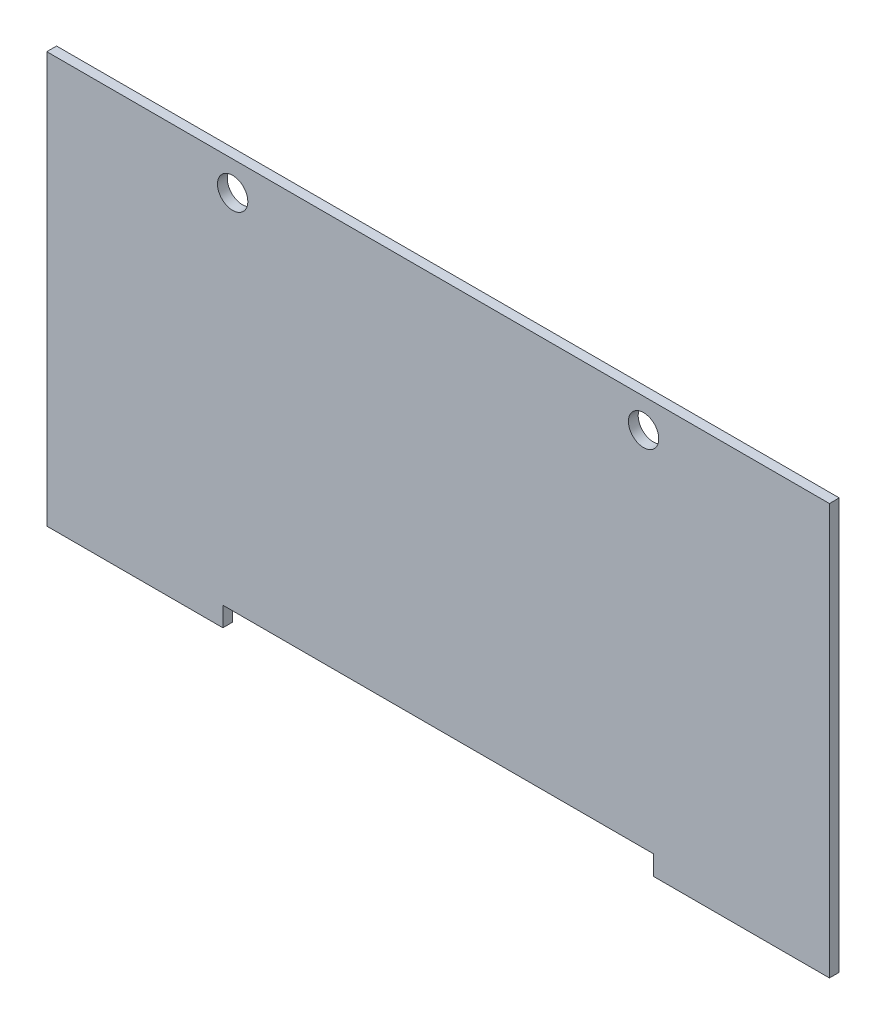
ISO-10303-21;
HEADER;
FILE_DESCRIPTION(('STEP AP214'),'2;1');
FILE_NAME('part.step','',(''),(''),'','','');
FILE_SCHEMA(('AUTOMOTIVE_DESIGN { 1 0 10303 214 1 1 1 1 }'));
ENDSEC;
DATA;
#1=APPLICATION_CONTEXT('core data for automotive mechanical design processes');
#2=APPLICATION_PROTOCOL_DEFINITION('international standard','automotive_design',2000,#1);
#3=PRODUCT_CONTEXT('',#1,'mechanical');
#4=PRODUCT('Part','Part','',(#3));
#5=PRODUCT_RELATED_PRODUCT_CATEGORY('part','',(#4));
#6=PRODUCT_DEFINITION_FORMATION('','',#4);
#7=PRODUCT_DEFINITION_CONTEXT('part definition',#1,'design');
#8=PRODUCT_DEFINITION('design','',#6,#7);
#9=PRODUCT_DEFINITION_SHAPE('','',#8);
#10=(LENGTH_UNIT() NAMED_UNIT(*) SI_UNIT(.MILLI.,.METRE.));
#11=(NAMED_UNIT(*) PLANE_ANGLE_UNIT() SI_UNIT($,.RADIAN.));
#12=(NAMED_UNIT(*) SI_UNIT($,.STERADIAN.) SOLID_ANGLE_UNIT());
#13=UNCERTAINTY_MEASURE_WITH_UNIT(LENGTH_MEASURE(1.E-05),#10,'distance_accuracy_value','');
#14=(GEOMETRIC_REPRESENTATION_CONTEXT(3) GLOBAL_UNCERTAINTY_ASSIGNED_CONTEXT((#13)) GLOBAL_UNIT_ASSIGNED_CONTEXT((#10,
#11,#12)) REPRESENTATION_CONTEXT('',''));
#15=CARTESIAN_POINT('',(0.,0.,0.));
#16=DIRECTION('',(0.,0.,1.));
#17=DIRECTION('',(1.,0.,0.));
#18=AXIS2_PLACEMENT_3D('',#15,#16,#17);
#19=CARTESIAN_POINT('',(0.,0.,1.));
#20=DIRECTION('',(0.,0.,-1.));
#21=DIRECTION('',(-1.,0.,0.));
#22=AXIS2_PLACEMENT_3D('',#19,#20,#21);
#23=PLANE('',#22);
#24=DIRECTION('',(1.,0.,0.));
#25=VECTOR('',#24,1.);
#26=CARTESIAN_POINT('',(18.,0.,1.));
#27=LINE('',#26,#25);
#28=CARTESIAN_POINT('',(0.,0.,1.));
#29=VERTEX_POINT('',#28);
#30=CARTESIAN_POINT('',(18.,0.,1.));
#31=VERTEX_POINT('',#30);
#32=EDGE_CURVE('E151',#29,#31,#27,.T.);
#33=ORIENTED_EDGE('',*,*,#32,.T.);
#34=DIRECTION('',(0.,1.,0.));
#35=VECTOR('',#34,1.);
#36=CARTESIAN_POINT('',(18.,2.,1.));
#37=LINE('',#36,#35);
#38=CARTESIAN_POINT('',(18.,2.,1.));
#39=VERTEX_POINT('',#38);
#40=EDGE_CURVE('E95',#31,#39,#37,.T.);
#41=ORIENTED_EDGE('',*,*,#40,.T.);
#42=DIRECTION('',(1.,0.,0.));
#43=VECTOR('',#42,1.);
#44=CARTESIAN_POINT('',(62.,2.,1.));
#45=LINE('',#44,#43);
#46=CARTESIAN_POINT('',(62.,2.,1.));
#47=VERTEX_POINT('',#46);
#48=EDGE_CURVE('E161',#39,#47,#45,.T.);
#49=ORIENTED_EDGE('',*,*,#48,.T.);
#50=DIRECTION('',(0.,-1.,0.));
#51=VECTOR('',#50,1.);
#52=CARTESIAN_POINT('',(62.,0.,1.));
#53=LINE('',#52,#51);
#54=CARTESIAN_POINT('',(62.,0.,1.));
#55=VERTEX_POINT('',#54);
#56=EDGE_CURVE('E163',#47,#55,#53,.T.);
#57=ORIENTED_EDGE('',*,*,#56,.T.);
#58=DIRECTION('',(1.,0.,0.));
#59=VECTOR('',#58,1.);
#60=CARTESIAN_POINT('',(80.,0.,1.));
#61=LINE('',#60,#59);
#62=CARTESIAN_POINT('',(80.,0.,1.));
#63=VERTEX_POINT('',#62);
#64=EDGE_CURVE('E114',#55,#63,#61,.T.);
#65=ORIENTED_EDGE('',*,*,#64,.T.);
#66=DIRECTION('',(0.,1.,0.));
#67=VECTOR('',#66,1.);
#68=CARTESIAN_POINT('',(80.,42.,1.));
#69=LINE('',#68,#67);
#70=CARTESIAN_POINT('',(80.,42.,1.));
#71=VERTEX_POINT('',#70);
#72=EDGE_CURVE('E108',#63,#71,#69,.T.);
#73=ORIENTED_EDGE('',*,*,#72,.T.);
#74=DIRECTION('',(-1.,0.,0.));
#75=VECTOR('',#74,1.);
#76=CARTESIAN_POINT('',(0.,42.,1.));
#77=LINE('',#76,#75);
#78=CARTESIAN_POINT('',(0.,42.,1.));
#79=VERTEX_POINT('',#78);
#80=EDGE_CURVE('E112',#71,#79,#77,.T.);
#81=ORIENTED_EDGE('',*,*,#80,.T.);
#82=DIRECTION('',(0.,-1.,0.));
#83=VECTOR('',#82,1.);
#84=CARTESIAN_POINT('',(0.,0.,1.));
#85=LINE('',#84,#83);
#86=EDGE_CURVE('E52',#79,#29,#85,.T.);
#87=ORIENTED_EDGE('',*,*,#86,.T.);
#88=EDGE_LOOP('',(#33,#41,#49,#57,#65,#73,#81,#87));
#89=FACE_BOUND('',#88,.T.);
#90=CARTESIAN_POINT('',(19.,39.,1.));
#91=DIRECTION('',(0.,0.,1.));
#92=DIRECTION('',(1.,0.,0.));
#93=AXIS2_PLACEMENT_3D('',#90,#91,#92);
#94=CIRCLE('',#93,1.55);
#95=CARTESIAN_POINT('',(20.55,39.,1.));
#96=VERTEX_POINT('',#95);
#97=EDGE_CURVE('E140',#96,#96,#94,.T.);
#98=ORIENTED_EDGE('',*,*,#97,.F.);
#99=EDGE_LOOP('',(#98));
#100=FACE_BOUND('',#99,.T.);
#101=CARTESIAN_POINT('',(61.,39.,1.));
#102=DIRECTION('',(0.,0.,1.));
#103=DIRECTION('',(1.,0.,0.));
#104=AXIS2_PLACEMENT_3D('',#101,#102,#103);
#105=CIRCLE('',#104,1.54999999999999);
#106=CARTESIAN_POINT('',(62.55,39.,1.));
#107=VERTEX_POINT('',#106);
#108=EDGE_CURVE('E150',#107,#107,#105,.T.);
#109=ORIENTED_EDGE('',*,*,#108,.F.);
#110=EDGE_LOOP('',(#109));
#111=FACE_BOUND('',#110,.T.);
#112=ADVANCED_FACE('F35',(#89,#100,#111),#23,.F.);
#113=CARTESIAN_POINT('',(0.,0.,0.));
#114=DIRECTION('',(0.,0.,-1.));
#115=DIRECTION('',(-1.,0.,0.));
#116=AXIS2_PLACEMENT_3D('',#113,#114,#115);
#117=PLANE('',#116);
#118=CARTESIAN_POINT('',(19.,39.,0.));
#119=DIRECTION('',(0.,0.,1.));
#120=DIRECTION('',(1.,0.,0.));
#121=AXIS2_PLACEMENT_3D('',#118,#119,#120);
#122=CIRCLE('',#121,1.55);
#123=CARTESIAN_POINT('',(20.55,39.,0.));
#124=VERTEX_POINT('',#123);
#125=EDGE_CURVE('E146',#124,#124,#122,.T.);
#126=ORIENTED_EDGE('',*,*,#125,.T.);
#127=EDGE_LOOP('',(#126));
#128=FACE_BOUND('',#127,.T.);
#129=DIRECTION('',(1.,0.,0.));
#130=VECTOR('',#129,1.);
#131=CARTESIAN_POINT('',(18.,0.,0.));
#132=LINE('',#131,#130);
#133=CARTESIAN_POINT('',(0.,0.,0.));
#134=VERTEX_POINT('',#133);
#135=CARTESIAN_POINT('',(18.,0.,0.));
#136=VERTEX_POINT('',#135);
#137=EDGE_CURVE('E145',#134,#136,#132,.T.);
#138=ORIENTED_EDGE('',*,*,#137,.F.);
#139=DIRECTION('',(0.,-1.,0.));
#140=VECTOR('',#139,1.);
#141=CARTESIAN_POINT('',(0.,0.,0.));
#142=LINE('',#141,#140);
#143=CARTESIAN_POINT('',(0.,42.,0.));
#144=VERTEX_POINT('',#143);
#145=EDGE_CURVE('E87',#144,#134,#142,.T.);
#146=ORIENTED_EDGE('',*,*,#145,.F.);
#147=DIRECTION('',(-1.,0.,0.));
#148=VECTOR('',#147,1.);
#149=CARTESIAN_POINT('',(0.,42.,0.));
#150=LINE('',#149,#148);
#151=CARTESIAN_POINT('',(80.,42.,0.));
#152=VERTEX_POINT('',#151);
#153=EDGE_CURVE('E81',#152,#144,#150,.T.);
#154=ORIENTED_EDGE('',*,*,#153,.F.);
#155=DIRECTION('',(0.,1.,0.));
#156=VECTOR('',#155,1.);
#157=CARTESIAN_POINT('',(80.,42.,0.));
#158=LINE('',#157,#156);
#159=CARTESIAN_POINT('',(80.,0.,0.));
#160=VERTEX_POINT('',#159);
#161=EDGE_CURVE('E122',#160,#152,#158,.T.);
#162=ORIENTED_EDGE('',*,*,#161,.F.);
#163=DIRECTION('',(1.,0.,0.));
#164=VECTOR('',#163,1.);
#165=CARTESIAN_POINT('',(80.,0.,0.));
#166=LINE('',#165,#164);
#167=CARTESIAN_POINT('',(62.,0.,0.));
#168=VERTEX_POINT('',#167);
#169=EDGE_CURVE('E182',#168,#160,#166,.T.);
#170=ORIENTED_EDGE('',*,*,#169,.F.);
#171=DIRECTION('',(0.,-1.,0.));
#172=VECTOR('',#171,1.);
#173=CARTESIAN_POINT('',(62.,0.,0.));
#174=LINE('',#173,#172);
#175=CARTESIAN_POINT('',(62.,2.,0.));
#176=VERTEX_POINT('',#175);
#177=EDGE_CURVE('E176',#176,#168,#174,.T.);
#178=ORIENTED_EDGE('',*,*,#177,.F.);
#179=DIRECTION('',(1.,0.,0.));
#180=VECTOR('',#179,1.);
#181=CARTESIAN_POINT('',(62.,2.,0.));
#182=LINE('',#181,#180);
#183=CARTESIAN_POINT('',(18.,2.,0.));
#184=VERTEX_POINT('',#183);
#185=EDGE_CURVE('E190',#184,#176,#182,.T.);
#186=ORIENTED_EDGE('',*,*,#185,.F.);
#187=DIRECTION('',(0.,1.,0.));
#188=VECTOR('',#187,1.);
#189=CARTESIAN_POINT('',(18.,2.,0.));
#190=LINE('',#189,#188);
#191=EDGE_CURVE('E195',#136,#184,#190,.T.);
#192=ORIENTED_EDGE('',*,*,#191,.F.);
#193=EDGE_LOOP('',(#138,#146,#154,#162,#170,#178,#186,#192));
#194=FACE_BOUND('',#193,.T.);
#195=CARTESIAN_POINT('',(61.,39.,0.));
#196=DIRECTION('',(0.,0.,1.));
#197=DIRECTION('',(1.,0.,0.));
#198=AXIS2_PLACEMENT_3D('',#195,#196,#197);
#199=CIRCLE('',#198,1.54999999999999);
#200=CARTESIAN_POINT('',(62.55,39.,0.));
#201=VERTEX_POINT('',#200);
#202=EDGE_CURVE('E147',#201,#201,#199,.T.);
#203=ORIENTED_EDGE('',*,*,#202,.T.);
#204=EDGE_LOOP('',(#203));
#205=FACE_BOUND('',#204,.T.);
#206=ADVANCED_FACE('F193',(#128,#194,#205),#117,.T.);
#207=CARTESIAN_POINT('',(18.,0.,1.));
#208=DIRECTION('',(0.,1.,0.));
#209=DIRECTION('',(0.,0.,1.));
#210=AXIS2_PLACEMENT_3D('',#207,#208,#209);
#211=PLANE('',#210);
#212=ORIENTED_EDGE('',*,*,#137,.T.);
#213=DIRECTION('',(0.,0.,-1.));
#214=VECTOR('',#213,1.);
#215=CARTESIAN_POINT('',(18.,0.,1.));
#216=LINE('',#215,#214);
#217=EDGE_CURVE('E12',#31,#136,#216,.T.);
#218=ORIENTED_EDGE('',*,*,#217,.F.);
#219=ORIENTED_EDGE('',*,*,#32,.F.);
#220=DIRECTION('',(0.,0.,-1.));
#221=VECTOR('',#220,1.);
#222=CARTESIAN_POINT('',(0.,0.,1.));
#223=LINE('',#222,#221);
#224=EDGE_CURVE('E128',#29,#134,#223,.T.);
#225=ORIENTED_EDGE('',*,*,#224,.T.);
#226=EDGE_LOOP('',(#212,#218,#219,#225));
#227=FACE_BOUND('',#226,.T.);
#228=ADVANCED_FACE('F37',(#227),#211,.F.);
#229=CARTESIAN_POINT('',(18.,2.,1.));
#230=DIRECTION('',(-1.,0.,0.));
#231=DIRECTION('',(0.,0.,1.));
#232=AXIS2_PLACEMENT_3D('',#229,#230,#231);
#233=PLANE('',#232);
#234=ORIENTED_EDGE('',*,*,#191,.T.);
#235=DIRECTION('',(0.,0.,-1.));
#236=VECTOR('',#235,1.);
#237=CARTESIAN_POINT('',(18.,2.,1.));
#238=LINE('',#237,#236);
#239=EDGE_CURVE('E44',#39,#184,#238,.T.);
#240=ORIENTED_EDGE('',*,*,#239,.F.);
#241=ORIENTED_EDGE('',*,*,#40,.F.);
#242=ORIENTED_EDGE('',*,*,#217,.T.);
#243=EDGE_LOOP('',(#234,#240,#241,#242));
#244=FACE_BOUND('',#243,.T.);
#245=ADVANCED_FACE('F209',(#244),#233,.F.);
#246=CARTESIAN_POINT('',(62.,2.,1.));
#247=DIRECTION('',(0.,1.,0.));
#248=DIRECTION('',(0.,0.,1.));
#249=AXIS2_PLACEMENT_3D('',#246,#247,#248);
#250=PLANE('',#249);
#251=ORIENTED_EDGE('',*,*,#185,.T.);
#252=DIRECTION('',(0.,0.,-1.));
#253=VECTOR('',#252,1.);
#254=CARTESIAN_POINT('',(62.,2.,1.));
#255=LINE('',#254,#253);
#256=EDGE_CURVE('E179',#47,#176,#255,.T.);
#257=ORIENTED_EDGE('',*,*,#256,.F.);
#258=ORIENTED_EDGE('',*,*,#48,.F.);
#259=ORIENTED_EDGE('',*,*,#239,.T.);
#260=EDGE_LOOP('',(#251,#257,#258,#259));
#261=FACE_BOUND('',#260,.T.);
#262=ADVANCED_FACE('F189',(#261),#250,.F.);
#263=CARTESIAN_POINT('',(62.,0.,1.));
#264=DIRECTION('',(1.,0.,0.));
#265=DIRECTION('',(0.,0.,-1.));
#266=AXIS2_PLACEMENT_3D('',#263,#264,#265);
#267=PLANE('',#266);
#268=ORIENTED_EDGE('',*,*,#177,.T.);
#269=DIRECTION('',(0.,0.,-1.));
#270=VECTOR('',#269,1.);
#271=CARTESIAN_POINT('',(62.,0.,1.));
#272=LINE('',#271,#270);
#273=EDGE_CURVE('E173',#55,#168,#272,.T.);
#274=ORIENTED_EDGE('',*,*,#273,.F.);
#275=ORIENTED_EDGE('',*,*,#56,.F.);
#276=ORIENTED_EDGE('',*,*,#256,.T.);
#277=EDGE_LOOP('',(#268,#274,#275,#276));
#278=FACE_BOUND('',#277,.T.);
#279=ADVANCED_FACE('F174',(#278),#267,.F.);
#280=CARTESIAN_POINT('',(80.,0.,1.));
#281=DIRECTION('',(0.,1.,0.));
#282=DIRECTION('',(0.,0.,1.));
#283=AXIS2_PLACEMENT_3D('',#280,#281,#282);
#284=PLANE('',#283);
#285=ORIENTED_EDGE('',*,*,#169,.T.);
#286=DIRECTION('',(0.,0.,-1.));
#287=VECTOR('',#286,1.);
#288=CARTESIAN_POINT('',(80.,0.,1.));
#289=LINE('',#288,#287);
#290=EDGE_CURVE('E123',#63,#160,#289,.T.);
#291=ORIENTED_EDGE('',*,*,#290,.F.);
#292=ORIENTED_EDGE('',*,*,#64,.F.);
#293=ORIENTED_EDGE('',*,*,#273,.T.);
#294=EDGE_LOOP('',(#285,#291,#292,#293));
#295=FACE_BOUND('',#294,.T.);
#296=ADVANCED_FACE('F181',(#295),#284,.F.);
#297=CARTESIAN_POINT('',(80.,42.,1.));
#298=DIRECTION('',(-1.,0.,0.));
#299=DIRECTION('',(0.,0.,1.));
#300=AXIS2_PLACEMENT_3D('',#297,#298,#299);
#301=PLANE('',#300);
#302=ORIENTED_EDGE('',*,*,#161,.T.);
#303=DIRECTION('',(0.,0.,-1.));
#304=VECTOR('',#303,1.);
#305=CARTESIAN_POINT('',(80.,42.,1.));
#306=LINE('',#305,#304);
#307=EDGE_CURVE('E119',#71,#152,#306,.T.);
#308=ORIENTED_EDGE('',*,*,#307,.F.);
#309=ORIENTED_EDGE('',*,*,#72,.F.);
#310=ORIENTED_EDGE('',*,*,#290,.T.);
#311=EDGE_LOOP('',(#302,#308,#309,#310));
#312=FACE_BOUND('',#311,.T.);
#313=ADVANCED_FACE('F120',(#312),#301,.F.);
#314=CARTESIAN_POINT('',(0.,42.,1.));
#315=DIRECTION('',(0.,-1.,0.));
#316=DIRECTION('',(0.,0.,-1.));
#317=AXIS2_PLACEMENT_3D('',#314,#315,#316);
#318=PLANE('',#317);
#319=ORIENTED_EDGE('',*,*,#153,.T.);
#320=DIRECTION('',(0.,0.,-1.));
#321=VECTOR('',#320,1.);
#322=CARTESIAN_POINT('',(0.,42.,1.));
#323=LINE('',#322,#321);
#324=EDGE_CURVE('E124',#79,#144,#323,.T.);
#325=ORIENTED_EDGE('',*,*,#324,.F.);
#326=ORIENTED_EDGE('',*,*,#80,.F.);
#327=ORIENTED_EDGE('',*,*,#307,.T.);
#328=EDGE_LOOP('',(#319,#325,#326,#327));
#329=FACE_BOUND('',#328,.T.);
#330=ADVANCED_FACE('F126',(#329),#318,.F.);
#331=CARTESIAN_POINT('',(0.,0.,1.));
#332=DIRECTION('',(1.,0.,0.));
#333=DIRECTION('',(0.,0.,-1.));
#334=AXIS2_PLACEMENT_3D('',#331,#332,#333);
#335=PLANE('',#334);
#336=ORIENTED_EDGE('',*,*,#145,.T.);
#337=ORIENTED_EDGE('',*,*,#224,.F.);
#338=ORIENTED_EDGE('',*,*,#86,.F.);
#339=ORIENTED_EDGE('',*,*,#324,.T.);
#340=EDGE_LOOP('',(#336,#337,#338,#339));
#341=FACE_BOUND('',#340,.T.);
#342=ADVANCED_FACE('F204',(#341),#335,.F.);
#343=CARTESIAN_POINT('',(19.,39.,1.));
#344=DIRECTION('',(0.,0.,-1.));
#345=DIRECTION('',(-1.,0.,0.));
#346=AXIS2_PLACEMENT_3D('',#343,#344,#345);
#347=CYLINDRICAL_SURFACE('',#346,1.55);
#348=ORIENTED_EDGE('',*,*,#97,.T.);
#349=EDGE_LOOP('',(#348));
#350=FACE_BOUND('',#349,.T.);
#351=ORIENTED_EDGE('',*,*,#125,.F.);
#352=EDGE_LOOP('',(#351));
#353=FACE_BOUND('',#352,.T.);
#354=ADVANCED_FACE('F224',(#350,#353),#347,.F.);
#355=CARTESIAN_POINT('',(61.,39.,1.));
#356=DIRECTION('',(0.,0.,-1.));
#357=DIRECTION('',(-1.,0.,0.));
#358=AXIS2_PLACEMENT_3D('',#355,#356,#357);
#359=CYLINDRICAL_SURFACE('',#358,1.54999999999999);
#360=ORIENTED_EDGE('',*,*,#108,.T.);
#361=EDGE_LOOP('',(#360));
#362=FACE_BOUND('',#361,.T.);
#363=ORIENTED_EDGE('',*,*,#202,.F.);
#364=EDGE_LOOP('',(#363));
#365=FACE_BOUND('',#364,.T.);
#366=ADVANCED_FACE('F262',(#362,#365),#359,.F.);
#367=CLOSED_SHELL('',(#112,#206,#228,#245,#262,#279,#296,#313,#330,#342,#354,#366));
#368=MANIFOLD_SOLID_BREP('B2',#367);
#369=ADVANCED_BREP_SHAPE_REPRESENTATION('',(#18,#368),#14);
#370=SHAPE_DEFINITION_REPRESENTATION(#9,#369);
ENDSEC;
END-ISO-10303-21;
